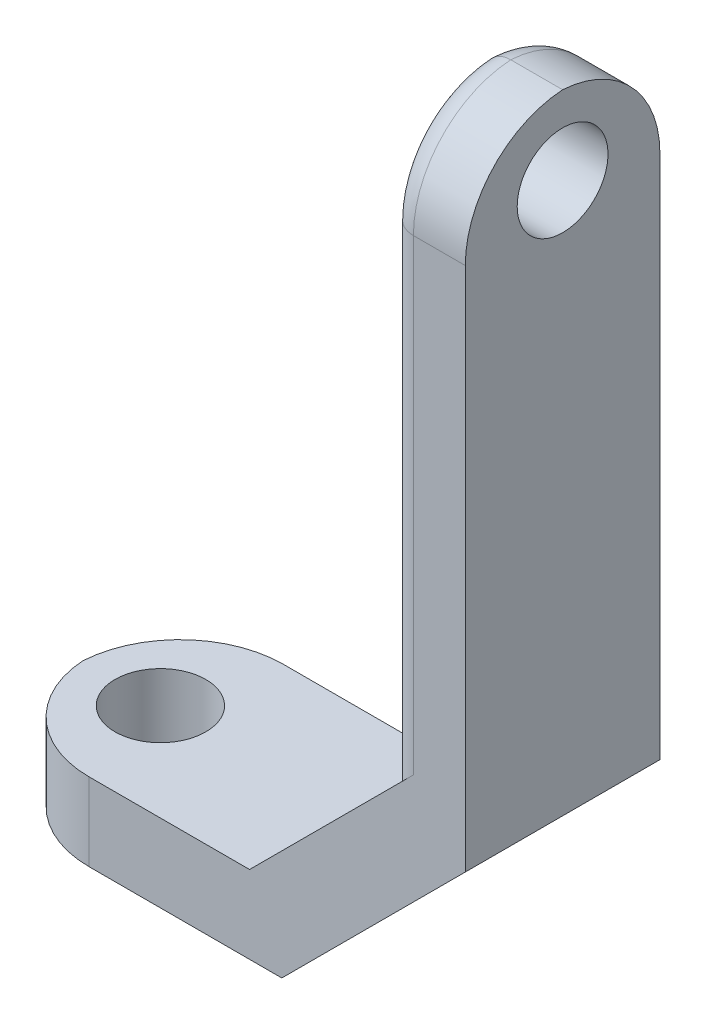
ISO-10303-21;
HEADER;
FILE_DESCRIPTION(('STEP AP214'),'2;1');
FILE_NAME('part.step','',(''),(''),'','','');
FILE_SCHEMA(('AUTOMOTIVE_DESIGN { 1 0 10303 214 1 1 1 1 }'));
ENDSEC;
DATA;
#1=APPLICATION_CONTEXT('core data for automotive mechanical design processes');
#2=APPLICATION_PROTOCOL_DEFINITION('international standard','automotive_design',2000,#1);
#3=PRODUCT_CONTEXT('',#1,'mechanical');
#4=PRODUCT('Part','Part','',(#3));
#5=PRODUCT_RELATED_PRODUCT_CATEGORY('part','',(#4));
#6=PRODUCT_DEFINITION_FORMATION('','',#4);
#7=PRODUCT_DEFINITION_CONTEXT('part definition',#1,'design');
#8=PRODUCT_DEFINITION('design','',#6,#7);
#9=PRODUCT_DEFINITION_SHAPE('','',#8);
#10=(LENGTH_UNIT() NAMED_UNIT(*) SI_UNIT(.MILLI.,.METRE.));
#11=(NAMED_UNIT(*) PLANE_ANGLE_UNIT() SI_UNIT($,.RADIAN.));
#12=(NAMED_UNIT(*) SI_UNIT($,.STERADIAN.) SOLID_ANGLE_UNIT());
#13=UNCERTAINTY_MEASURE_WITH_UNIT(LENGTH_MEASURE(1.E-05),#10,'distance_accuracy_value','');
#14=(GEOMETRIC_REPRESENTATION_CONTEXT(3) GLOBAL_UNCERTAINTY_ASSIGNED_CONTEXT((#13)) GLOBAL_UNIT_ASSIGNED_CONTEXT((#10,
#11,#12)) REPRESENTATION_CONTEXT('',''));
#15=CARTESIAN_POINT('',(0.,0.,0.));
#16=DIRECTION('',(0.,0.,1.));
#17=DIRECTION('',(1.,0.,0.));
#18=AXIS2_PLACEMENT_3D('',#15,#16,#17);
#19=CARTESIAN_POINT('',(20.3725830020307,0.,15.));
#20=DIRECTION('',(0.,-1.,0.));
#21=DIRECTION('',(1.,0.,0.));
#22=AXIS2_PLACEMENT_3D('',#19,#20,#21);
#23=PLANE('',#22);
#24=CARTESIAN_POINT('',(6.,0.,7.5));
#25=DIRECTION('',(0.,1.,0.));
#26=DIRECTION('',(-1.,0.,0.));
#27=AXIS2_PLACEMENT_3D('',#24,#25,#26);
#28=CIRCLE('',#27,3.5);
#29=CARTESIAN_POINT('',(2.5,0.,7.5));
#30=VERTEX_POINT('',#29);
#31=EDGE_CURVE('E316',#30,#30,#28,.T.);
#32=ORIENTED_EDGE('',*,*,#31,.F.);
#33=EDGE_LOOP('',(#32));
#34=FACE_BOUND('',#33,.T.);
#35=CARTESIAN_POINT('',(8.,0.,8.));
#36=DIRECTION('',(0.,-1.,0.));
#37=DIRECTION('',(1.,0.,0.));
#38=AXIS2_PLACEMENT_3D('',#35,#36,#37);
#39=CIRCLE('',#38,8.);
#40=CARTESIAN_POINT('',(8.,0.,0.));
#41=VERTEX_POINT('',#40);
#42=CARTESIAN_POINT('',(0.015640288664345,0.,7.5));
#43=VERTEX_POINT('',#42);
#44=EDGE_CURVE('E194',#41,#43,#39,.F.);
#45=ORIENTED_EDGE('',*,*,#44,.T.);
#46=CARTESIAN_POINT('',(8.,0.,7.));
#47=DIRECTION('',(0.,-1.,0.));
#48=DIRECTION('',(1.,0.,0.));
#49=AXIS2_PLACEMENT_3D('',#46,#47,#48);
#50=CIRCLE('',#49,8.);
#51=CARTESIAN_POINT('',(8.,0.,15.));
#52=VERTEX_POINT('',#51);
#53=EDGE_CURVE('E193',#43,#52,#50,.F.);
#54=ORIENTED_EDGE('',*,*,#53,.T.);
#55=DIRECTION('',(-1.,0.,0.));
#56=VECTOR('',#55,1.);
#57=CARTESIAN_POINT('',(20.3725830020307,0.,15.));
#58=LINE('',#57,#56);
#59=CARTESIAN_POINT('',(20.3725830020307,0.,15.));
#60=VERTEX_POINT('',#59);
#61=EDGE_CURVE('E149',#60,#52,#58,.T.);
#62=ORIENTED_EDGE('',*,*,#61,.F.);
#63=DIRECTION('',(0.,0.,-1.));
#64=VECTOR('',#63,1.);
#65=CARTESIAN_POINT('',(20.3725830020307,0.,15.));
#66=LINE('',#65,#64);
#67=CARTESIAN_POINT('',(20.3725830020307,0.,0.));
#68=VERTEX_POINT('',#67);
#69=EDGE_CURVE('E169',#60,#68,#66,.T.);
#70=ORIENTED_EDGE('',*,*,#69,.T.);
#71=DIRECTION('',(-1.,0.,0.));
#72=VECTOR('',#71,1.);
#73=CARTESIAN_POINT('',(20.3725830020307,0.,0.));
#74=LINE('',#73,#72);
#75=EDGE_CURVE('E167',#68,#41,#74,.T.);
#76=ORIENTED_EDGE('',*,*,#75,.T.);
#77=EDGE_LOOP('',(#45,#54,#62,#70,#76));
#78=FACE_BOUND('',#77,.T.);
#79=ADVANCED_FACE('F43',(#34,#78),#23,.F.);
#80=CARTESIAN_POINT('',(0.,-6.,15.));
#81=DIRECTION('',(0.,1.,0.));
#82=DIRECTION('',(-1.,0.,0.));
#83=AXIS2_PLACEMENT_3D('',#80,#81,#82);
#84=PLANE('',#83);
#85=CARTESIAN_POINT('',(6.,-6.00000000000003,7.5));
#86=DIRECTION('',(0.,1.,0.));
#87=DIRECTION('',(-1.,0.,0.));
#88=AXIS2_PLACEMENT_3D('',#85,#86,#87);
#89=CIRCLE('',#88,3.5);
#90=CARTESIAN_POINT('',(2.5,-6.00000000000003,7.5));
#91=VERTEX_POINT('',#90);
#92=EDGE_CURVE('E173',#91,#91,#89,.T.);
#93=ORIENTED_EDGE('',*,*,#92,.T.);
#94=EDGE_LOOP('',(#93));
#95=FACE_BOUND('',#94,.T.);
#96=DIRECTION('',(1.,0.,0.));
#97=VECTOR('',#96,1.);
#98=CARTESIAN_POINT('',(0.,-6.,15.));
#99=LINE('',#98,#97);
#100=CARTESIAN_POINT('',(8.,-6.00000000000001,15.));
#101=VERTEX_POINT('',#100);
#102=CARTESIAN_POINT('',(22.8578643762693,-6.00000000000003,15.));
#103=VERTEX_POINT('',#102);
#104=EDGE_CURVE('E137',#101,#103,#99,.T.);
#105=ORIENTED_EDGE('',*,*,#104,.F.);
#106=CARTESIAN_POINT('',(8.,-6.00000000000001,7.));
#107=DIRECTION('',(0.,1.,0.));
#108=DIRECTION('',(-1.,0.,0.));
#109=AXIS2_PLACEMENT_3D('',#106,#107,#108);
#110=CIRCLE('',#109,8.);
#111=CARTESIAN_POINT('',(0.015640288664345,-6.,7.5));
#112=VERTEX_POINT('',#111);
#113=EDGE_CURVE('E192',#101,#112,#110,.F.);
#114=ORIENTED_EDGE('',*,*,#113,.T.);
#115=CARTESIAN_POINT('',(8.,-6.00000000000001,8.));
#116=DIRECTION('',(0.,1.,0.));
#117=DIRECTION('',(-1.,0.,0.));
#118=AXIS2_PLACEMENT_3D('',#115,#116,#117);
#119=CIRCLE('',#118,8.);
#120=CARTESIAN_POINT('',(8.,-6.00000000000001,0.));
#121=VERTEX_POINT('',#120);
#122=EDGE_CURVE('E186',#112,#121,#119,.F.);
#123=ORIENTED_EDGE('',*,*,#122,.T.);
#124=DIRECTION('',(1.,0.,0.));
#125=VECTOR('',#124,1.);
#126=CARTESIAN_POINT('',(0.,-6.,0.));
#127=LINE('',#126,#125);
#128=CARTESIAN_POINT('',(22.8578643762693,-6.00000000000003,0.));
#129=VERTEX_POINT('',#128);
#130=EDGE_CURVE('E155',#121,#129,#127,.T.);
#131=ORIENTED_EDGE('',*,*,#130,.T.);
#132=DIRECTION('',(0.,0.,-1.));
#133=VECTOR('',#132,1.);
#134=CARTESIAN_POINT('',(22.8578643762693,-6.00000000000003,15.));
#135=LINE('',#134,#133);
#136=EDGE_CURVE('E153',#103,#129,#135,.T.);
#137=ORIENTED_EDGE('',*,*,#136,.F.);
#138=EDGE_LOOP('',(#105,#114,#123,#131,#137));
#139=FACE_BOUND('',#138,.T.);
#140=ADVANCED_FACE('F154',(#95,#139),#84,.F.);
#141=CARTESIAN_POINT('',(22.8578643762693,-6.00000000000003,15.));
#142=DIRECTION('',(-0.707106781186549,0.707106781186546,0.));
#143=DIRECTION('',(-0.707106781186546,-0.707106781186549,0.));
#144=AXIS2_PLACEMENT_3D('',#141,#142,#143);
#145=PLANE('',#144);
#146=DIRECTION('',(0.707106781186546,0.707106781186549,0.));
#147=VECTOR('',#146,1.);
#148=CARTESIAN_POINT('',(22.8578643762693,-6.00000000000003,0.));
#149=LINE('',#148,#147);
#150=CARTESIAN_POINT('',(37.0000000000002,8.14213562373096,0.));
#151=VERTEX_POINT('',#150);
#152=EDGE_CURVE('E174',#129,#151,#149,.T.);
#153=ORIENTED_EDGE('',*,*,#152,.T.);
#154=DIRECTION('',(0.,0.,-1.));
#155=VECTOR('',#154,1.);
#156=CARTESIAN_POINT('',(37.0000000000002,8.14213562373096,15.));
#157=LINE('',#156,#155);
#158=CARTESIAN_POINT('',(37.0000000000002,8.14213562373096,15.));
#159=VERTEX_POINT('',#158);
#160=EDGE_CURVE('E158',#159,#151,#157,.T.);
#161=ORIENTED_EDGE('',*,*,#160,.F.);
#162=DIRECTION('',(0.707106781186546,0.707106781186549,0.));
#163=VECTOR('',#162,1.);
#164=CARTESIAN_POINT('',(22.8578643762693,-6.00000000000003,15.));
#165=LINE('',#164,#163);
#166=EDGE_CURVE('E145',#103,#159,#165,.T.);
#167=ORIENTED_EDGE('',*,*,#166,.F.);
#168=ORIENTED_EDGE('',*,*,#136,.T.);
#169=EDGE_LOOP('',(#153,#161,#167,#168));
#170=FACE_BOUND('',#169,.T.);
#171=ADVANCED_FACE('F156',(#170),#145,.F.);
#172=CARTESIAN_POINT('',(37.0000000000002,8.14213562373096,15.));
#173=DIRECTION('',(-1.,0.,0.));
#174=DIRECTION('',(0.,-1.,0.));
#175=AXIS2_PLACEMENT_3D('',#172,#173,#174);
#176=PLANE('',#175);
#177=CARTESIAN_POINT('',(37.0000000000002,50.5685424949239,7.5));
#178=DIRECTION('',(-1.,0.,0.));
#179=DIRECTION('',(0.,0.,1.));
#180=AXIS2_PLACEMENT_3D('',#177,#178,#179);
#181=CIRCLE('',#180,3.50000000000001);
#182=CARTESIAN_POINT('',(37.0000000000002,50.5685424949239,11.));
#183=VERTEX_POINT('',#182);
#184=EDGE_CURVE('E325',#183,#183,#181,.T.);
#185=ORIENTED_EDGE('',*,*,#184,.T.);
#186=EDGE_LOOP('',(#185));
#187=FACE_BOUND('',#186,.T.);
#188=DIRECTION('',(0.,1.,0.));
#189=VECTOR('',#188,1.);
#190=CARTESIAN_POINT('',(37.0000000000002,8.14213562373096,0.));
#191=LINE('',#190,#189);
#192=CARTESIAN_POINT('',(37.0000000000002,48.6274169979695,0.));
#193=VERTEX_POINT('',#192);
#194=EDGE_CURVE('E180',#151,#193,#191,.T.);
#195=ORIENTED_EDGE('',*,*,#194,.T.);
#196=CARTESIAN_POINT('',(37.0000000000002,48.6274169979695,8.));
#197=DIRECTION('',(-1.,0.,0.));
#198=DIRECTION('',(0.,-1.,0.));
#199=AXIS2_PLACEMENT_3D('',#196,#197,#198);
#200=CIRCLE('',#199,8.);
#201=CARTESIAN_POINT('',(37.0000000000002,56.6117767093052,7.5));
#202=VERTEX_POINT('',#201);
#203=EDGE_CURVE('E203',#193,#202,#200,.F.);
#204=ORIENTED_EDGE('',*,*,#203,.T.);
#205=CARTESIAN_POINT('',(37.0000000000002,48.6274169979695,7.));
#206=DIRECTION('',(-1.,0.,0.));
#207=DIRECTION('',(0.,-1.,0.));
#208=AXIS2_PLACEMENT_3D('',#205,#206,#207);
#209=CIRCLE('',#208,8.);
#210=CARTESIAN_POINT('',(37.0000000000002,48.6274169979695,15.));
#211=VERTEX_POINT('',#210);
#212=EDGE_CURVE('E202',#202,#211,#209,.F.);
#213=ORIENTED_EDGE('',*,*,#212,.T.);
#214=DIRECTION('',(0.,1.,0.));
#215=VECTOR('',#214,1.);
#216=CARTESIAN_POINT('',(37.0000000000002,8.14213562373096,15.));
#217=LINE('',#216,#215);
#218=EDGE_CURVE('E161',#159,#211,#217,.T.);
#219=ORIENTED_EDGE('',*,*,#218,.F.);
#220=ORIENTED_EDGE('',*,*,#160,.T.);
#221=EDGE_LOOP('',(#195,#204,#213,#219,#220));
#222=FACE_BOUND('',#221,.T.);
#223=ADVANCED_FACE('F304',(#187,#222),#176,.F.);
#224=CARTESIAN_POINT('',(31.,56.6274169979693,15.));
#225=DIRECTION('',(1.,0.,0.));
#226=DIRECTION('',(0.,1.,0.));
#227=AXIS2_PLACEMENT_3D('',#224,#225,#226);
#228=PLANE('',#227);
#229=CARTESIAN_POINT('',(31.,50.5685424949239,7.5));
#230=DIRECTION('',(-1.,0.,0.));
#231=DIRECTION('',(0.,0.,1.));
#232=AXIS2_PLACEMENT_3D('',#229,#230,#231);
#233=CIRCLE('',#232,3.50000000000001);
#234=CARTESIAN_POINT('',(31.,50.5685424949239,11.));
#235=VERTEX_POINT('',#234);
#236=EDGE_CURVE('E208',#235,#235,#233,.T.);
#237=ORIENTED_EDGE('',*,*,#236,.F.);
#238=EDGE_LOOP('',(#237));
#239=FACE_BOUND('',#238,.T.);
#240=DIRECTION('',(0.,0.,-1.));
#241=VECTOR('',#240,1.);
#242=CARTESIAN_POINT('',(31.,10.6274169979693,15.));
#243=LINE('',#242,#241);
#244=CARTESIAN_POINT('',(31.,10.6274169979693,13.));
#245=VERTEX_POINT('',#244);
#246=CARTESIAN_POINT('',(31.,10.6274169979693,2.));
#247=VERTEX_POINT('',#246);
#248=EDGE_CURVE('E182',#245,#247,#243,.T.);
#249=ORIENTED_EDGE('',*,*,#248,.F.);
#250=DIRECTION('',(0.,-1.,0.));
#251=VECTOR('',#250,1.);
#252=CARTESIAN_POINT('',(31.,48.6274169979693,13.));
#253=LINE('',#252,#251);
#254=CARTESIAN_POINT('',(31.,48.6274169979694,13.));
#255=VERTEX_POINT('',#254);
#256=EDGE_CURVE('E220',#245,#255,#253,.F.);
#257=ORIENTED_EDGE('',*,*,#256,.T.);
#258=CARTESIAN_POINT('',(31.,48.6274169979694,7.));
#259=DIRECTION('',(1.,0.,0.));
#260=DIRECTION('',(0.,1.,0.));
#261=AXIS2_PLACEMENT_3D('',#258,#259,#260);
#262=CIRCLE('',#261,6.);
#263=CARTESIAN_POINT('',(31.,54.6065473695201,7.5));
#264=VERTEX_POINT('',#263);
#265=EDGE_CURVE('E218',#255,#264,#262,.F.);
#266=ORIENTED_EDGE('',*,*,#265,.T.);
#267=CARTESIAN_POINT('',(31.,48.6274169979694,8.));
#268=DIRECTION('',(1.,0.,0.));
#269=DIRECTION('',(0.,1.,0.));
#270=AXIS2_PLACEMENT_3D('',#267,#268,#269);
#271=CIRCLE('',#270,6.);
#272=CARTESIAN_POINT('',(31.,48.6274169979694,2.));
#273=VERTEX_POINT('',#272);
#274=EDGE_CURVE('E211',#264,#273,#271,.F.);
#275=ORIENTED_EDGE('',*,*,#274,.T.);
#276=DIRECTION('',(0.,-1.,0.));
#277=VECTOR('',#276,1.);
#278=CARTESIAN_POINT('',(31.,56.6274169979693,2.));
#279=LINE('',#278,#277);
#280=EDGE_CURVE('E207',#273,#247,#279,.T.);
#281=ORIENTED_EDGE('',*,*,#280,.T.);
#282=EDGE_LOOP('',(#249,#257,#266,#275,#281));
#283=FACE_BOUND('',#282,.T.);
#284=ADVANCED_FACE('F301',(#239,#283),#228,.F.);
#285=CARTESIAN_POINT('',(31.,10.6274169979693,15.));
#286=DIRECTION('',(0.707106781186549,-0.707106781186546,0.));
#287=DIRECTION('',(0.707106781186546,0.707106781186549,0.));
#288=AXIS2_PLACEMENT_3D('',#285,#286,#287);
#289=PLANE('',#288);
#290=DIRECTION('',(-0.707106781186546,-0.707106781186549,0.));
#291=VECTOR('',#290,1.);
#292=CARTESIAN_POINT('',(31.,10.6274169979693,0.));
#293=LINE('',#292,#291);
#294=CARTESIAN_POINT('',(33.,12.6274169979693,0.));
#295=VERTEX_POINT('',#294);
#296=EDGE_CURVE('E58',#295,#68,#293,.T.);
#297=ORIENTED_EDGE('',*,*,#296,.T.);
#298=ORIENTED_EDGE('',*,*,#69,.F.);
#299=DIRECTION('',(-0.707106781186546,-0.707106781186549,0.));
#300=VECTOR('',#299,1.);
#301=CARTESIAN_POINT('',(31.,10.6274169979693,15.));
#302=LINE('',#301,#300);
#303=CARTESIAN_POINT('',(33.,12.6274169979693,15.));
#304=VERTEX_POINT('',#303);
#305=EDGE_CURVE('E69',#304,#60,#302,.T.);
#306=ORIENTED_EDGE('',*,*,#305,.F.);
#307=CARTESIAN_POINT('',(33.,12.6274169979693,13.));
#308=DIRECTION('',(0.707106781186549,-0.707106781186546,0.));
#309=DIRECTION('',(0.707106781186546,0.707106781186549,0.));
#310=AXIS2_PLACEMENT_3D('',#307,#308,#309);
#311=ELLIPSE('',#310,2.82842712474619,2.);
#312=EDGE_CURVE('E55',#304,#245,#311,.T.);
#313=ORIENTED_EDGE('',*,*,#312,.T.);
#314=ORIENTED_EDGE('',*,*,#248,.T.);
#315=CARTESIAN_POINT('',(33.,12.6274169979693,2.));
#316=DIRECTION('',(0.707106781186549,-0.707106781186546,0.));
#317=DIRECTION('',(-0.707106781186546,-0.707106781186549,0.));
#318=AXIS2_PLACEMENT_3D('',#315,#316,#317);
#319=ELLIPSE('',#318,2.82842712474619,2.);
#320=EDGE_CURVE('E11',#247,#295,#319,.T.);
#321=ORIENTED_EDGE('',*,*,#320,.T.);
#322=EDGE_LOOP('',(#297,#298,#306,#313,#314,#321));
#323=FACE_BOUND('',#322,.T.);
#324=ADVANCED_FACE('F309',(#323),#289,.F.);
#325=CARTESIAN_POINT('',(0.,0.,15.));
#326=DIRECTION('',(0.,0.,1.));
#327=DIRECTION('',(1.,0.,0.));
#328=AXIS2_PLACEMENT_3D('',#325,#326,#327);
#329=PLANE('',#328);
#330=DIRECTION('',(-1.,0.,0.));
#331=VECTOR('',#330,1.);
#332=CARTESIAN_POINT('',(31.0000000000003,48.6274169979693,15.));
#333=LINE('',#332,#331);
#334=CARTESIAN_POINT('',(33.,48.6274169979694,15.));
#335=VERTEX_POINT('',#334);
#336=EDGE_CURVE('E160',#211,#335,#333,.T.);
#337=ORIENTED_EDGE('',*,*,#336,.T.);
#338=DIRECTION('',(0.,-1.,0.));
#339=VECTOR('',#338,1.);
#340=CARTESIAN_POINT('',(33.,10.6274169979693,15.));
#341=LINE('',#340,#339);
#342=EDGE_CURVE('E221',#335,#304,#341,.T.);
#343=ORIENTED_EDGE('',*,*,#342,.T.);
#344=ORIENTED_EDGE('',*,*,#305,.T.);
#345=ORIENTED_EDGE('',*,*,#61,.T.);
#346=DIRECTION('',(0.,-1.,0.));
#347=VECTOR('',#346,1.);
#348=CARTESIAN_POINT('',(8.,-6.,15.));
#349=LINE('',#348,#347);
#350=EDGE_CURVE('E147',#52,#101,#349,.T.);
#351=ORIENTED_EDGE('',*,*,#350,.T.);
#352=ORIENTED_EDGE('',*,*,#104,.T.);
#353=ORIENTED_EDGE('',*,*,#166,.T.);
#354=ORIENTED_EDGE('',*,*,#218,.T.);
#355=EDGE_LOOP('',(#337,#343,#344,#345,#351,#352,#353,#354));
#356=FACE_BOUND('',#355,.T.);
#357=ADVANCED_FACE('F139',(#356),#329,.T.);
#358=CARTESIAN_POINT('',(0.,0.,0.));
#359=DIRECTION('',(0.,0.,1.));
#360=DIRECTION('',(1.,0.,0.));
#361=AXIS2_PLACEMENT_3D('',#358,#359,#360);
#362=PLANE('',#361);
#363=ORIENTED_EDGE('',*,*,#296,.F.);
#364=DIRECTION('',(0.,-1.,0.));
#365=VECTOR('',#364,1.);
#366=CARTESIAN_POINT('',(33.,0.,0.));
#367=LINE('',#366,#365);
#368=CARTESIAN_POINT('',(33.,48.6274169979694,0.));
#369=VERTEX_POINT('',#368);
#370=EDGE_CURVE('E227',#295,#369,#367,.F.);
#371=ORIENTED_EDGE('',*,*,#370,.T.);
#372=DIRECTION('',(-1.,0.,0.));
#373=VECTOR('',#372,1.);
#374=CARTESIAN_POINT('',(-2.02452292421965E-12,48.627416997968,0.));
#375=LINE('',#374,#373);
#376=EDGE_CURVE('E199',#369,#193,#375,.F.);
#377=ORIENTED_EDGE('',*,*,#376,.T.);
#378=ORIENTED_EDGE('',*,*,#194,.F.);
#379=ORIENTED_EDGE('',*,*,#152,.F.);
#380=ORIENTED_EDGE('',*,*,#130,.F.);
#381=DIRECTION('',(0.,-1.,0.));
#382=VECTOR('',#381,1.);
#383=CARTESIAN_POINT('',(8.,0.,0.));
#384=LINE('',#383,#382);
#385=EDGE_CURVE('E200',#121,#41,#384,.F.);
#386=ORIENTED_EDGE('',*,*,#385,.T.);
#387=ORIENTED_EDGE('',*,*,#75,.F.);
#388=EDGE_LOOP('',(#363,#371,#377,#378,#379,#380,#386,#387));
#389=FACE_BOUND('',#388,.T.);
#390=ADVANCED_FACE('F312',(#389),#362,.F.);
#391=CARTESIAN_POINT('',(6.,-6.00000000000003,7.5));
#392=DIRECTION('',(0.,1.,0.));
#393=DIRECTION('',(-1.,0.,0.));
#394=AXIS2_PLACEMENT_3D('',#391,#392,#393);
#395=CYLINDRICAL_SURFACE('',#394,3.5);
#396=ORIENTED_EDGE('',*,*,#92,.F.);
#397=EDGE_LOOP('',(#396));
#398=FACE_BOUND('',#397,.T.);
#399=ORIENTED_EDGE('',*,*,#31,.T.);
#400=EDGE_LOOP('',(#399));
#401=FACE_BOUND('',#400,.T.);
#402=ADVANCED_FACE('F335',(#398,#401),#395,.F.);
#403=CARTESIAN_POINT('',(37.0000000000002,50.5685424949239,7.5));
#404=DIRECTION('',(-1.,0.,0.));
#405=DIRECTION('',(0.,0.,1.));
#406=AXIS2_PLACEMENT_3D('',#403,#404,#405);
#407=CYLINDRICAL_SURFACE('',#406,3.50000000000001);
#408=ORIENTED_EDGE('',*,*,#184,.F.);
#409=EDGE_LOOP('',(#408));
#410=FACE_BOUND('',#409,.T.);
#411=ORIENTED_EDGE('',*,*,#236,.T.);
#412=EDGE_LOOP('',(#411));
#413=FACE_BOUND('',#412,.T.);
#414=ADVANCED_FACE('F273',(#410,#413),#407,.F.);
#415=CARTESIAN_POINT('',(8.,0.,8.));
#416=DIRECTION('',(0.,-1.,0.));
#417=DIRECTION('',(0.,0.,-1.));
#418=AXIS2_PLACEMENT_3D('',#415,#416,#417);
#419=CYLINDRICAL_SURFACE('',#418,8.);
#420=DIRECTION('',(0.,-1.,0.));
#421=VECTOR('',#420,1.);
#422=CARTESIAN_POINT('',(0.015640288664345,-3.00000000000001,7.5));
#423=LINE('',#422,#421);
#424=EDGE_CURVE('E210',#43,#112,#423,.T.);
#425=ORIENTED_EDGE('',*,*,#424,.F.);
#426=ORIENTED_EDGE('',*,*,#44,.F.);
#427=ORIENTED_EDGE('',*,*,#385,.F.);
#428=ORIENTED_EDGE('',*,*,#122,.F.);
#429=EDGE_LOOP('',(#425,#426,#427,#428));
#430=FACE_BOUND('',#429,.T.);
#431=ADVANCED_FACE('F272',(#430),#419,.T.);
#432=CARTESIAN_POINT('',(8.,0.,7.));
#433=DIRECTION('',(0.,1.,0.));
#434=DIRECTION('',(0.,0.,1.));
#435=AXIS2_PLACEMENT_3D('',#432,#433,#434);
#436=CYLINDRICAL_SURFACE('',#435,8.);
#437=ORIENTED_EDGE('',*,*,#53,.F.);
#438=ORIENTED_EDGE('',*,*,#424,.T.);
#439=ORIENTED_EDGE('',*,*,#113,.F.);
#440=ORIENTED_EDGE('',*,*,#350,.F.);
#441=EDGE_LOOP('',(#437,#438,#439,#440));
#442=FACE_BOUND('',#441,.T.);
#443=ADVANCED_FACE('F270',(#442),#436,.T.);
#444=CARTESIAN_POINT('',(-2.02452292421965E-12,48.627416997968,7.));
#445=DIRECTION('',(1.,0.,0.));
#446=DIRECTION('',(0.,1.,0.));
#447=AXIS2_PLACEMENT_3D('',#444,#445,#446);
#448=CYLINDRICAL_SURFACE('',#447,8.);
#449=DIRECTION('',(1.,0.,0.));
#450=VECTOR('',#449,1.);
#451=CARTESIAN_POINT('',(33.9999999999999,56.6117767093051,7.5));
#452=LINE('',#451,#450);
#453=CARTESIAN_POINT('',(32.9999999999999,56.611776709305,7.5));
#454=VERTEX_POINT('',#453);
#455=EDGE_CURVE('E212',#454,#202,#452,.T.);
#456=ORIENTED_EDGE('',*,*,#455,.F.);
#457=CARTESIAN_POINT('',(33.,48.6274169979694,7.));
#458=DIRECTION('',(1.,0.,0.));
#459=DIRECTION('',(0.,1.,0.));
#460=AXIS2_PLACEMENT_3D('',#457,#458,#459);
#461=CIRCLE('',#460,8.);
#462=EDGE_CURVE('E222',#454,#335,#461,.T.);
#463=ORIENTED_EDGE('',*,*,#462,.T.);
#464=ORIENTED_EDGE('',*,*,#336,.F.);
#465=ORIENTED_EDGE('',*,*,#212,.F.);
#466=EDGE_LOOP('',(#456,#463,#464,#465));
#467=FACE_BOUND('',#466,.T.);
#468=ADVANCED_FACE('F266',(#467),#448,.T.);
#469=CARTESIAN_POINT('',(37.0000000000006,48.6274169979695,8.));
#470=DIRECTION('',(-1.,0.,0.));
#471=DIRECTION('',(0.,-1.,0.));
#472=AXIS2_PLACEMENT_3D('',#469,#470,#471);
#473=CYLINDRICAL_SURFACE('',#472,8.);
#474=ORIENTED_EDGE('',*,*,#376,.F.);
#475=CARTESIAN_POINT('',(32.9999999999999,48.6274169979694,8.));
#476=DIRECTION('',(1.,0.,0.));
#477=DIRECTION('',(0.,1.,0.));
#478=AXIS2_PLACEMENT_3D('',#475,#476,#477);
#479=CIRCLE('',#478,8.);
#480=EDGE_CURVE('E223',#369,#454,#479,.T.);
#481=ORIENTED_EDGE('',*,*,#480,.T.);
#482=ORIENTED_EDGE('',*,*,#455,.T.);
#483=ORIENTED_EDGE('',*,*,#203,.F.);
#484=EDGE_LOOP('',(#474,#481,#482,#483));
#485=FACE_BOUND('',#484,.T.);
#486=ADVANCED_FACE('F252',(#485),#473,.T.);
#487=CARTESIAN_POINT('',(33.,56.6274169979693,2.));
#488=DIRECTION('',(0.,-1.,0.));
#489=DIRECTION('',(1.,0.,0.));
#490=AXIS2_PLACEMENT_3D('',#487,#488,#489);
#491=CYLINDRICAL_SURFACE('',#490,2.);
#492=ORIENTED_EDGE('',*,*,#320,.F.);
#493=ORIENTED_EDGE('',*,*,#280,.F.);
#494=CARTESIAN_POINT('',(33.,48.6274169979694,2.));
#495=DIRECTION('',(0.,1.,0.));
#496=DIRECTION('',(0.,0.,1.));
#497=AXIS2_PLACEMENT_3D('',#494,#495,#496);
#498=CIRCLE('',#497,2.);
#499=EDGE_CURVE('E50',#369,#273,#498,.T.);
#500=ORIENTED_EDGE('',*,*,#499,.F.);
#501=ORIENTED_EDGE('',*,*,#370,.F.);
#502=EDGE_LOOP('',(#492,#493,#500,#501));
#503=FACE_BOUND('',#502,.T.);
#504=ADVANCED_FACE('F44',(#503),#491,.T.);
#505=CARTESIAN_POINT('',(33.,0.,13.));
#506=DIRECTION('',(0.,1.,0.));
#507=DIRECTION('',(-1.,0.,0.));
#508=AXIS2_PLACEMENT_3D('',#505,#506,#507);
#509=CYLINDRICAL_SURFACE('',#508,2.);
#510=ORIENTED_EDGE('',*,*,#312,.F.);
#511=ORIENTED_EDGE('',*,*,#342,.F.);
#512=CARTESIAN_POINT('',(33.,48.6274169979694,13.));
#513=DIRECTION('',(0.,1.,0.));
#514=DIRECTION('',(0.,0.,1.));
#515=AXIS2_PLACEMENT_3D('',#512,#513,#514);
#516=CIRCLE('',#515,2.);
#517=EDGE_CURVE('E240',#255,#335,#516,.T.);
#518=ORIENTED_EDGE('',*,*,#517,.F.);
#519=ORIENTED_EDGE('',*,*,#256,.F.);
#520=EDGE_LOOP('',(#510,#511,#518,#519));
#521=FACE_BOUND('',#520,.T.);
#522=ADVANCED_FACE('F242',(#521),#509,.T.);
#523=CARTESIAN_POINT('',(33.,48.6274169979694,8.));
#524=DIRECTION('',(1.,0.,0.));
#525=DIRECTION('',(0.,1.,0.));
#526=AXIS2_PLACEMENT_3D('',#523,#524,#525);
#527=TOROIDAL_SURFACE('',#526,6.,2.);
#528=ORIENTED_EDGE('',*,*,#499,.T.);
#529=ORIENTED_EDGE('',*,*,#274,.F.);
#530=CARTESIAN_POINT('',(32.9999999999999,56.611776709305,7.5));
#531=CARTESIAN_POINT('',(32.9438185928244,56.6117763774349,7.5));
#532=CARTESIAN_POINT('',(32.8876641236087,56.6094033165999,7.5));
#533=CARTESIAN_POINT('',(32.7757574671406,56.5999365064434,7.5));
#534=CARTESIAN_POINT('',(32.7200052595785,56.5928429971626,7.5));
#535=CARTESIAN_POINT('',(32.5540464417921,56.5645493471133,7.5));
#536=CARTESIAN_POINT('',(32.4449523377208,56.5363358975184,7.5));
#537=CARTESIAN_POINT('',(32.2330543099408,56.4619972243747,7.5));
#538=CARTESIAN_POINT('',(32.1302533107601,56.4158637451003,7.5));
#539=CARTESIAN_POINT('',(31.9338561447391,56.3070117709192,7.5));
#540=CARTESIAN_POINT('',(31.8402579473902,56.2442969458413,7.5));
#541=CARTESIAN_POINT('',(31.6648421761219,56.1040219893973,7.5));
#542=CARTESIAN_POINT('',(31.5830325993048,56.0264518628806,7.5));
#543=CARTESIAN_POINT('',(31.4335410274434,55.8586725034759,7.5));
#544=CARTESIAN_POINT('',(31.3658635820421,55.7684592158705,7.5));
#545=CARTESIAN_POINT('',(31.2464375694744,55.5777880740919,7.5));
#546=CARTESIAN_POINT('',(31.1947232238855,55.4773088167801,7.5));
#547=CARTESIAN_POINT('',(31.108886912458,55.2691433852137,7.5));
#548=CARTESIAN_POINT('',(31.0747511055672,55.1614629567629,7.5));
#549=CARTESIAN_POINT('',(31.0340919343016,54.9823046535779,7.5));
#550=CARTESIAN_POINT('',(31.0220335392007,54.9120268625999,7.5));
#551=CARTESIAN_POINT('',(31.0054411358882,54.7706596902877,7.5));
#552=CARTESIAN_POINT('',(31.000895073815,54.6995717937413,7.5));
#553=CARTESIAN_POINT('',(31.0000397686286,54.6211784890293,7.5));
#554=CARTESIAN_POINT('',(30.9999998957024,54.6138626160542,7.5));
#555=CARTESIAN_POINT('',(31.,54.6065473695201,7.5));
#556=B_SPLINE_CURVE_WITH_KNOTS('',3,(#530,#531,#532,#533,#534,#535,#536,#537,#538,#539,#540,
#541,#542,#543,#544,#545,#546,#547,#548,#549,#550,#551,#552,#553,#554,#555),.UNSPECIFIED.,.F.,
.F.,(4,2,2,2,2,2,2,2,2,2,2,2,4),(0.,0.168440623036462,0.336872681312429,0.673187982062415,
1.00965840678542,1.34605442520291,1.68267758257255,2.01940894456778,2.35685725410474,
2.6940394545612,2.90760933156199,3.12083619258115,3.14278362293974),.UNSPECIFIED.);
#557=EDGE_CURVE('E229',#454,#264,#556,.T.);
#558=ORIENTED_EDGE('',*,*,#557,.F.);
#559=ORIENTED_EDGE('',*,*,#480,.F.);
#560=EDGE_LOOP('',(#528,#529,#558,#559));
#561=FACE_BOUND('',#560,.T.);
#562=ADVANCED_FACE('F241',(#561),#527,.T.);
#563=CARTESIAN_POINT('',(33.,48.6274169979694,7.));
#564=DIRECTION('',(1.,0.,0.));
#565=DIRECTION('',(0.,1.,0.));
#566=AXIS2_PLACEMENT_3D('',#563,#564,#565);
#567=TOROIDAL_SURFACE('',#566,6.,2.);
#568=ORIENTED_EDGE('',*,*,#517,.T.);
#569=ORIENTED_EDGE('',*,*,#462,.F.);
#570=ORIENTED_EDGE('',*,*,#557,.T.);
#571=ORIENTED_EDGE('',*,*,#265,.F.);
#572=EDGE_LOOP('',(#568,#569,#570,#571));
#573=FACE_BOUND('',#572,.T.);
#574=ADVANCED_FACE('F238',(#573),#567,.T.);
#575=CLOSED_SHELL('',(#79,#140,#171,#223,#284,#324,#357,#390,#402,#414,#431,#443,#468,#486,#504,
#522,#562,#574));
#576=MANIFOLD_SOLID_BREP('B2',#575);
#577=ADVANCED_BREP_SHAPE_REPRESENTATION('',(#18,#576),#14);
#578=SHAPE_DEFINITION_REPRESENTATION(#9,#577);
ENDSEC;
END-ISO-10303-21;
